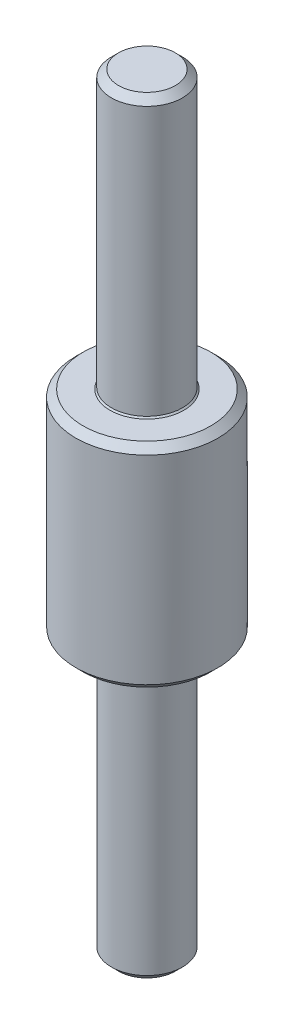
ISO-10303-21;
HEADER;
FILE_DESCRIPTION(('STEP AP214'),'2;1');
FILE_NAME('part.step','',(''),(''),'','','');
FILE_SCHEMA(('AUTOMOTIVE_DESIGN { 1 0 10303 214 1 1 1 1 }'));
ENDSEC;
DATA;
#1=APPLICATION_CONTEXT('core data for automotive mechanical design processes');
#2=APPLICATION_PROTOCOL_DEFINITION('international standard','automotive_design',2000,#1);
#3=PRODUCT_CONTEXT('',#1,'mechanical');
#4=PRODUCT('Part','Part','',(#3));
#5=PRODUCT_RELATED_PRODUCT_CATEGORY('part','',(#4));
#6=PRODUCT_DEFINITION_FORMATION('','',#4);
#7=PRODUCT_DEFINITION_CONTEXT('part definition',#1,'design');
#8=PRODUCT_DEFINITION('design','',#6,#7);
#9=PRODUCT_DEFINITION_SHAPE('','',#8);
#10=(LENGTH_UNIT() NAMED_UNIT(*) SI_UNIT(.MILLI.,.METRE.));
#11=(NAMED_UNIT(*) PLANE_ANGLE_UNIT() SI_UNIT($,.RADIAN.));
#12=(NAMED_UNIT(*) SI_UNIT($,.STERADIAN.) SOLID_ANGLE_UNIT());
#13=UNCERTAINTY_MEASURE_WITH_UNIT(LENGTH_MEASURE(1.E-05),#10,'distance_accuracy_value','');
#14=(GEOMETRIC_REPRESENTATION_CONTEXT(3) GLOBAL_UNCERTAINTY_ASSIGNED_CONTEXT((#13)) GLOBAL_UNIT_ASSIGNED_CONTEXT((#10,
#11,#12)) REPRESENTATION_CONTEXT('',''));
#15=CARTESIAN_POINT('',(0.,0.,0.));
#16=DIRECTION('',(0.,0.,1.));
#17=DIRECTION('',(1.,0.,0.));
#18=AXIS2_PLACEMENT_3D('',#15,#16,#17);
#19=CARTESIAN_POINT('',(0.,54.,0.));
#20=DIRECTION('',(0.,-1.,0.));
#21=DIRECTION('',(1.,0.,0.));
#22=AXIS2_PLACEMENT_3D('',#19,#20,#21);
#23=PLANE('',#22);
#24=CARTESIAN_POINT('',(0.,54.,0.));
#25=DIRECTION('',(0.,-1.,0.));
#26=DIRECTION('',(1.,0.,0.));
#27=AXIS2_PLACEMENT_3D('',#24,#25,#26);
#28=CIRCLE('',#27,3.99999999999999);
#29=CARTESIAN_POINT('',(3.99999999999997,54.,0.));
#30=VERTEX_POINT('',#29);
#31=EDGE_CURVE('E59',#30,#30,#28,.F.);
#32=ORIENTED_EDGE('',*,*,#31,.T.);
#33=EDGE_LOOP('',(#32));
#34=FACE_BOUND('',#33,.T.);
#35=ADVANCED_FACE('F35',(#34),#23,.F.);
#36=CARTESIAN_POINT('',(0.,54.,0.));
#37=DIRECTION('',(0.,1.,0.));
#38=DIRECTION('',(-1.,0.,0.));
#39=AXIS2_PLACEMENT_3D('',#36,#37,#38);
#40=CYLINDRICAL_SURFACE('',#39,5.00000000000001);
#41=CARTESIAN_POINT('',(0.,15.2,0.));
#42=DIRECTION('',(0.,-1.,0.));
#43=DIRECTION('',(1.,0.,0.));
#44=AXIS2_PLACEMENT_3D('',#41,#42,#43);
#45=CIRCLE('',#44,5.00000000000001);
#46=CARTESIAN_POINT('',(5.,15.2,0.));
#47=VERTEX_POINT('',#46);
#48=EDGE_CURVE('E51',#47,#47,#45,.F.);
#49=ORIENTED_EDGE('',*,*,#48,.T.);
#50=EDGE_LOOP('',(#49));
#51=FACE_BOUND('',#50,.T.);
#52=CARTESIAN_POINT('',(0.,53.,0.));
#53=DIRECTION('',(0.,-1.,0.));
#54=DIRECTION('',(1.,0.,0.));
#55=AXIS2_PLACEMENT_3D('',#52,#53,#54);
#56=CIRCLE('',#55,5.00000000000001);
#57=CARTESIAN_POINT('',(4.99999999999999,53.,0.));
#58=VERTEX_POINT('',#57);
#59=EDGE_CURVE('E56',#58,#58,#56,.T.);
#60=ORIENTED_EDGE('',*,*,#59,.T.);
#61=EDGE_LOOP('',(#60));
#62=FACE_BOUND('',#61,.T.);
#63=ADVANCED_FACE('F93',(#51,#62),#40,.T.);
#64=CARTESIAN_POINT('',(5.00000000000001,15.,0.));
#65=DIRECTION('',(0.,-1.,0.));
#66=DIRECTION('',(1.,0.,0.));
#67=AXIS2_PLACEMENT_3D('',#64,#65,#66);
#68=PLANE('',#67);
#69=CARTESIAN_POINT('',(0.,15.,0.));
#70=DIRECTION('',(0.,-1.,0.));
#71=DIRECTION('',(1.,0.,0.));
#72=AXIS2_PLACEMENT_3D('',#69,#70,#71);
#73=CIRCLE('',#72,5.20000000000002);
#74=CARTESIAN_POINT('',(5.20000000000002,15.,0.));
#75=VERTEX_POINT('',#74);
#76=EDGE_CURVE('E47',#75,#75,#73,.T.);
#77=ORIENTED_EDGE('',*,*,#76,.T.);
#78=EDGE_LOOP('',(#77));
#79=FACE_BOUND('',#78,.T.);
#80=CARTESIAN_POINT('',(0.,15.,0.));
#81=DIRECTION('',(0.,-1.,0.));
#82=DIRECTION('',(1.,0.,0.));
#83=AXIS2_PLACEMENT_3D('',#80,#81,#82);
#84=CIRCLE('',#83,9.00000000000001);
#85=CARTESIAN_POINT('',(9.,15.,0.));
#86=VERTEX_POINT('',#85);
#87=EDGE_CURVE('E68',#86,#86,#84,.F.);
#88=ORIENTED_EDGE('',*,*,#87,.T.);
#89=EDGE_LOOP('',(#88));
#90=FACE_BOUND('',#89,.T.);
#91=ADVANCED_FACE('F91',(#79,#90),#68,.F.);
#92=CARTESIAN_POINT('',(0.,54.,0.));
#93=DIRECTION('',(0.,1.,0.));
#94=DIRECTION('',(-1.,0.,0.));
#95=AXIS2_PLACEMENT_3D('',#92,#93,#94);
#96=CYLINDRICAL_SURFACE('',#95,10.);
#97=CARTESIAN_POINT('',(0.,-14.,0.));
#98=DIRECTION('',(0.,1.,0.));
#99=DIRECTION('',(-1.,0.,0.));
#100=AXIS2_PLACEMENT_3D('',#97,#98,#99);
#101=CIRCLE('',#100,10.);
#102=CARTESIAN_POINT('',(-10.,-14.,0.));
#103=VERTEX_POINT('',#102);
#104=EDGE_CURVE('E74',#103,#103,#101,.T.);
#105=ORIENTED_EDGE('',*,*,#104,.T.);
#106=EDGE_LOOP('',(#105));
#107=FACE_BOUND('',#106,.T.);
#108=CARTESIAN_POINT('',(0.,14.,0.));
#109=DIRECTION('',(0.,-1.,0.));
#110=DIRECTION('',(1.,0.,0.));
#111=AXIS2_PLACEMENT_3D('',#108,#109,#110);
#112=CIRCLE('',#111,10.);
#113=CARTESIAN_POINT('',(10.,14.,0.));
#114=VERTEX_POINT('',#113);
#115=EDGE_CURVE('E77',#114,#114,#112,.T.);
#116=ORIENTED_EDGE('',*,*,#115,.T.);
#117=EDGE_LOOP('',(#116));
#118=FACE_BOUND('',#117,.T.);
#119=ADVANCED_FACE('F81',(#107,#118),#96,.T.);
#120=CARTESIAN_POINT('',(10.,-15.,0.));
#121=DIRECTION('',(0.,1.,0.));
#122=DIRECTION('',(-1.,0.,0.));
#123=AXIS2_PLACEMENT_3D('',#120,#121,#122);
#124=PLANE('',#123);
#125=CARTESIAN_POINT('',(0.,-15.,0.));
#126=DIRECTION('',(0.,1.,0.));
#127=DIRECTION('',(-1.,0.,0.));
#128=AXIS2_PLACEMENT_3D('',#125,#126,#127);
#129=CIRCLE('',#128,5.20000000000003);
#130=CARTESIAN_POINT('',(-5.20000000000003,-15.,0.));
#131=VERTEX_POINT('',#130);
#132=EDGE_CURVE('E43',#131,#131,#129,.T.);
#133=ORIENTED_EDGE('',*,*,#132,.T.);
#134=EDGE_LOOP('',(#133));
#135=FACE_BOUND('',#134,.T.);
#136=CARTESIAN_POINT('',(0.,-15.,0.));
#137=DIRECTION('',(0.,1.,0.));
#138=DIRECTION('',(-1.,0.,0.));
#139=AXIS2_PLACEMENT_3D('',#136,#137,#138);
#140=CIRCLE('',#139,9.00000000000004);
#141=CARTESIAN_POINT('',(-9.00000000000004,-15.,0.));
#142=VERTEX_POINT('',#141);
#143=EDGE_CURVE('E71',#142,#142,#140,.F.);
#144=ORIENTED_EDGE('',*,*,#143,.T.);
#145=EDGE_LOOP('',(#144));
#146=FACE_BOUND('',#145,.T.);
#147=ADVANCED_FACE('F100',(#135,#146),#124,.F.);
#148=CARTESIAN_POINT('',(0.,54.,0.));
#149=DIRECTION('',(0.,1.,0.));
#150=DIRECTION('',(-1.,0.,0.));
#151=AXIS2_PLACEMENT_3D('',#148,#149,#150);
#152=CYLINDRICAL_SURFACE('',#151,5.00000000000001);
#153=CARTESIAN_POINT('',(0.,-15.2,0.));
#154=DIRECTION('',(0.,1.,0.));
#155=DIRECTION('',(-1.,0.,0.));
#156=AXIS2_PLACEMENT_3D('',#153,#154,#155);
#157=CIRCLE('',#156,5.00000000000001);
#158=CARTESIAN_POINT('',(-5.00000000000001,-15.2,0.));
#159=VERTEX_POINT('',#158);
#160=EDGE_CURVE('E10',#159,#159,#157,.F.);
#161=ORIENTED_EDGE('',*,*,#160,.T.);
#162=EDGE_LOOP('',(#161));
#163=FACE_BOUND('',#162,.T.);
#164=CARTESIAN_POINT('',(0.,-53.0000000000001,0.));
#165=DIRECTION('',(0.,1.,0.));
#166=DIRECTION('',(-1.,0.,0.));
#167=AXIS2_PLACEMENT_3D('',#164,#165,#166);
#168=CIRCLE('',#167,5.00000000000001);
#169=CARTESIAN_POINT('',(-5.,-53.0000000000001,0.));
#170=VERTEX_POINT('',#169);
#171=EDGE_CURVE('E65',#170,#170,#168,.T.);
#172=ORIENTED_EDGE('',*,*,#171,.T.);
#173=EDGE_LOOP('',(#172));
#174=FACE_BOUND('',#173,.T.);
#175=ADVANCED_FACE('F163',(#163,#174),#152,.T.);
#176=CARTESIAN_POINT('',(5.00000000000002,-54.,0.));
#177=DIRECTION('',(0.,1.,0.));
#178=DIRECTION('',(-1.,0.,0.));
#179=AXIS2_PLACEMENT_3D('',#176,#177,#178);
#180=PLANE('',#179);
#181=CARTESIAN_POINT('',(0.,-54.,0.));
#182=DIRECTION('',(0.,1.,0.));
#183=DIRECTION('',(-1.,0.,0.));
#184=AXIS2_PLACEMENT_3D('',#181,#182,#183);
#185=CIRCLE('',#184,4.00000000000006);
#186=CARTESIAN_POINT('',(-4.00000000000005,-54.,0.));
#187=VERTEX_POINT('',#186);
#188=EDGE_CURVE('E62',#187,#187,#185,.F.);
#189=ORIENTED_EDGE('',*,*,#188,.T.);
#190=EDGE_LOOP('',(#189));
#191=FACE_BOUND('',#190,.T.);
#192=ADVANCED_FACE('F116',(#191),#180,.F.);
#193=CARTESIAN_POINT('',(0.,-14.,0.));
#194=DIRECTION('',(0.,1.,0.));
#195=DIRECTION('',(-1.,0.,0.));
#196=AXIS2_PLACEMENT_3D('',#193,#194,#195);
#197=CONICAL_SURFACE('',#196,10.,0.785398163397447);
#198=ORIENTED_EDGE('',*,*,#143,.F.);
#199=EDGE_LOOP('',(#198));
#200=FACE_BOUND('',#199,.T.);
#201=ORIENTED_EDGE('',*,*,#104,.F.);
#202=EDGE_LOOP('',(#201));
#203=FACE_BOUND('',#202,.T.);
#204=ADVANCED_FACE('F87',(#200,#203),#197,.T.);
#205=CARTESIAN_POINT('',(0.,15.,0.));
#206=DIRECTION('',(0.,-1.,0.));
#207=DIRECTION('',(1.,0.,0.));
#208=AXIS2_PLACEMENT_3D('',#205,#206,#207);
#209=CONICAL_SURFACE('',#208,9.00000000000001,0.785398163397444);
#210=ORIENTED_EDGE('',*,*,#115,.F.);
#211=EDGE_LOOP('',(#210));
#212=FACE_BOUND('',#211,.T.);
#213=ORIENTED_EDGE('',*,*,#87,.F.);
#214=EDGE_LOOP('',(#213));
#215=FACE_BOUND('',#214,.T.);
#216=ADVANCED_FACE('F83',(#212,#215),#209,.T.);
#217=CARTESIAN_POINT('',(0.,-53.0000000000001,0.));
#218=DIRECTION('',(0.,1.,0.));
#219=DIRECTION('',(-1.,0.,0.));
#220=AXIS2_PLACEMENT_3D('',#217,#218,#219);
#221=CONICAL_SURFACE('',#220,5.00000000000001,0.785398163397457);
#222=ORIENTED_EDGE('',*,*,#188,.F.);
#223=EDGE_LOOP('',(#222));
#224=FACE_BOUND('',#223,.T.);
#225=ORIENTED_EDGE('',*,*,#171,.F.);
#226=EDGE_LOOP('',(#225));
#227=FACE_BOUND('',#226,.T.);
#228=ADVANCED_FACE('F86',(#224,#227),#221,.T.);
#229=CARTESIAN_POINT('',(0.,54.,0.));
#230=DIRECTION('',(0.,-1.,0.));
#231=DIRECTION('',(1.,0.,0.));
#232=AXIS2_PLACEMENT_3D('',#229,#230,#231);
#233=CONICAL_SURFACE('',#232,3.99999999999999,0.785398163397446);
#234=ORIENTED_EDGE('',*,*,#59,.F.);
#235=EDGE_LOOP('',(#234));
#236=FACE_BOUND('',#235,.T.);
#237=ORIENTED_EDGE('',*,*,#31,.F.);
#238=EDGE_LOOP('',(#237));
#239=FACE_BOUND('',#238,.T.);
#240=ADVANCED_FACE('F127',(#236,#239),#233,.T.);
#241=CARTESIAN_POINT('',(0.,15.2,0.));
#242=DIRECTION('',(0.,-1.,0.));
#243=DIRECTION('',(1.,0.,0.));
#244=AXIS2_PLACEMENT_3D('',#241,#242,#243);
#245=CONICAL_SURFACE('',#244,5.00000000000001,0.785398163397425);
#246=CARTESIAN_POINT('',(5.20000000000002,15.,0.));
#247=CARTESIAN_POINT('',(5.19791666666669,15.0020833333333,0.));
#248=CARTESIAN_POINT('',(5.19583333333335,15.0041666666667,0.));
#249=CARTESIAN_POINT('',(5.19166666666669,15.0083333333333,0.));
#250=CARTESIAN_POINT('',(5.18958333333335,15.0104166666667,0.));
#251=CARTESIAN_POINT('',(5.18541666666668,15.0145833333333,0.));
#252=CARTESIAN_POINT('',(5.18333333333335,15.0166666666667,0.));
#253=CARTESIAN_POINT('',(5.17916666666668,15.0208333333333,0.));
#254=CARTESIAN_POINT('',(5.17708333333335,15.0229166666667,0.));
#255=CARTESIAN_POINT('',(5.17291666666668,15.0270833333333,0.));
#256=CARTESIAN_POINT('',(5.17083333333335,15.0291666666667,0.));
#257=CARTESIAN_POINT('',(5.16666666666668,15.0333333333333,0.));
#258=CARTESIAN_POINT('',(5.16458333333335,15.0354166666667,0.));
#259=CARTESIAN_POINT('',(5.16041666666668,15.0395833333333,0.));
#260=CARTESIAN_POINT('',(5.15833333333335,15.0416666666667,0.));
#261=CARTESIAN_POINT('',(5.15416666666668,15.0458333333333,0.));
#262=CARTESIAN_POINT('',(5.15208333333335,15.0479166666667,0.));
#263=CARTESIAN_POINT('',(5.14791666666668,15.0520833333333,0.));
#264=CARTESIAN_POINT('',(5.14583333333335,15.0541666666667,0.));
#265=CARTESIAN_POINT('',(5.14166666666668,15.0583333333333,0.));
#266=CARTESIAN_POINT('',(5.13958333333335,15.0604166666667,0.));
#267=CARTESIAN_POINT('',(5.13541666666668,15.0645833333333,0.));
#268=CARTESIAN_POINT('',(5.13333333333335,15.0666666666667,0.));
#269=CARTESIAN_POINT('',(5.12916666666668,15.0708333333333,0.));
#270=CARTESIAN_POINT('',(5.12708333333335,15.0729166666667,0.));
#271=CARTESIAN_POINT('',(5.12291666666668,15.0770833333333,0.));
#272=CARTESIAN_POINT('',(5.12083333333334,15.0791666666667,0.));
#273=CARTESIAN_POINT('',(5.11666666666668,15.0833333333333,0.));
#274=CARTESIAN_POINT('',(5.11458333333334,15.0854166666667,0.));
#275=CARTESIAN_POINT('',(5.11041666666668,15.0895833333333,0.));
#276=CARTESIAN_POINT('',(5.10833333333334,15.0916666666667,0.));
#277=CARTESIAN_POINT('',(5.10416666666668,15.0958333333333,0.));
#278=CARTESIAN_POINT('',(5.10208333333334,15.0979166666667,0.));
#279=CARTESIAN_POINT('',(5.09791666666668,15.1020833333333,0.));
#280=CARTESIAN_POINT('',(5.09583333333334,15.1041666666667,0.));
#281=CARTESIAN_POINT('',(5.09166666666668,15.1083333333333,0.));
#282=CARTESIAN_POINT('',(5.08958333333334,15.1104166666667,0.));
#283=CARTESIAN_POINT('',(5.08541666666668,15.1145833333333,0.));
#284=CARTESIAN_POINT('',(5.08333333333334,15.1166666666667,0.));
#285=CARTESIAN_POINT('',(5.07916666666667,15.1208333333333,0.));
#286=CARTESIAN_POINT('',(5.07708333333334,15.1229166666667,0.));
#287=CARTESIAN_POINT('',(5.07291666666667,15.1270833333333,0.));
#288=CARTESIAN_POINT('',(5.07083333333334,15.1291666666667,0.));
#289=CARTESIAN_POINT('',(5.06666666666667,15.1333333333334,0.));
#290=CARTESIAN_POINT('',(5.06458333333334,15.1354166666667,0.));
#291=CARTESIAN_POINT('',(5.06041666666667,15.1395833333334,0.));
#292=CARTESIAN_POINT('',(5.05833333333334,15.1416666666667,0.));
#293=CARTESIAN_POINT('',(5.05416666666667,15.1458333333334,0.));
#294=CARTESIAN_POINT('',(5.05208333333334,15.1479166666667,0.));
#295=CARTESIAN_POINT('',(5.04791666666667,15.1520833333334,0.));
#296=CARTESIAN_POINT('',(5.04583333333334,15.1541666666667,0.));
#297=CARTESIAN_POINT('',(5.04166666666667,15.1583333333334,0.));
#298=CARTESIAN_POINT('',(5.03958333333334,15.1604166666667,0.));
#299=CARTESIAN_POINT('',(5.03541666666667,15.1645833333334,0.));
#300=CARTESIAN_POINT('',(5.03333333333334,15.1666666666667,0.));
#301=CARTESIAN_POINT('',(5.02916666666667,15.1708333333334,0.));
#302=CARTESIAN_POINT('',(5.02708333333334,15.1729166666667,0.));
#303=CARTESIAN_POINT('',(5.02291666666667,15.1770833333334,0.));
#304=CARTESIAN_POINT('',(5.02083333333334,15.1791666666667,0.));
#305=CARTESIAN_POINT('',(5.01666666666667,15.1833333333334,0.));
#306=CARTESIAN_POINT('',(5.01458333333333,15.1854166666667,0.));
#307=CARTESIAN_POINT('',(5.01041666666667,15.1895833333334,0.));
#308=CARTESIAN_POINT('',(5.00833333333333,15.1916666666667,0.));
#309=CARTESIAN_POINT('',(5.00416666666667,15.1958333333334,0.));
#310=CARTESIAN_POINT('',(5.00208333333333,15.1979166666667,0.));
#311=CARTESIAN_POINT('',(5.,15.2,0.));
#312=B_SPLINE_CURVE_WITH_KNOTS('',3,(#246,#247,#248,#249,#250,#251,#252,#253,#254,#255,#256,
#257,#258,#259,#260,#261,#262,#263,#264,#265,#266,#267,#268,#269,#270,#271,#272,#273,#274,#275,
#276,#277,#278,#279,#280,#281,#282,#283,#284,#285,#286,#287,#288,#289,#290,#291,#292,#293,#294,
#295,#296,#297,#298,#299,#300,#301,#302,#303,#304,#305,#306,#307,#308,#309,#310,#311),
.UNSPECIFIED.,.F.,.F.,(4,2,2,2,2,2,2,2,2,2,2,2,2,2,2,2,2,2,2,2,2,2,2,2,2,2,2,2,2,2,2,2,4),(0.,
0.00883883476483271,0.017677669529666,0.0265165042944987,0.0353553390593321,0.0441941738241648,
0.0530330085889981,0.0618718433538308,0.0707106781186641,0.0795495128834968,0.0883883476483302,
0.0972271824131616,0.106066017177995,0.114904851942828,0.123743686707661,0.132582521472494,
0.141421356237326,0.15026019100216,0.159099025766993,0.167937860531826,0.176776695296659,
0.185615530061492,0.194454364826323,0.203293199591157,0.212132034355989,0.220970869120823,
0.229809703885655,0.238648538650489,0.247487373415321,0.256326208180155,0.265165042944987,
0.274003877709821,0.282842712474654),.UNSPECIFIED.);
#313=EDGE_CURVE('BSEAM133',#75,#47,#312,.T.);
#314=ORIENTED_EDGE('',*,*,#76,.F.);
#315=ORIENTED_EDGE('',*,*,#48,.F.);
#316=ORIENTED_EDGE('',*,*,#313,.T.);
#317=ORIENTED_EDGE('',*,*,#313,.F.);
#318=EDGE_LOOP('',(#314,#316,#315,#317));
#319=FACE_BOUND('',#318,.T.);
#320=ADVANCED_FACE('F133',(#319),#245,.T.);
#321=CARTESIAN_POINT('',(0.,-15.,0.));
#322=DIRECTION('',(0.,1.,0.));
#323=DIRECTION('',(-1.,0.,0.));
#324=AXIS2_PLACEMENT_3D('',#321,#322,#323);
#325=CONICAL_SURFACE('',#324,5.20000000000002,0.785398163397472);
#326=ORIENTED_EDGE('',*,*,#160,.F.);
#327=EDGE_LOOP('',(#326));
#328=FACE_BOUND('',#327,.T.);
#329=ORIENTED_EDGE('',*,*,#132,.F.);
#330=EDGE_LOOP('',(#329));
#331=FACE_BOUND('',#330,.T.);
#332=ADVANCED_FACE('F38',(#328,#331),#325,.T.);
#333=CLOSED_SHELL('',(#35,#63,#91,#119,#147,#175,#192,#204,#216,#228,#240,#320,#332));
#334=MANIFOLD_SOLID_BREP('B2',#333);
#335=ADVANCED_BREP_SHAPE_REPRESENTATION('',(#18,#334),#14);
#336=SHAPE_DEFINITION_REPRESENTATION(#9,#335);
ENDSEC;
END-ISO-10303-21;
